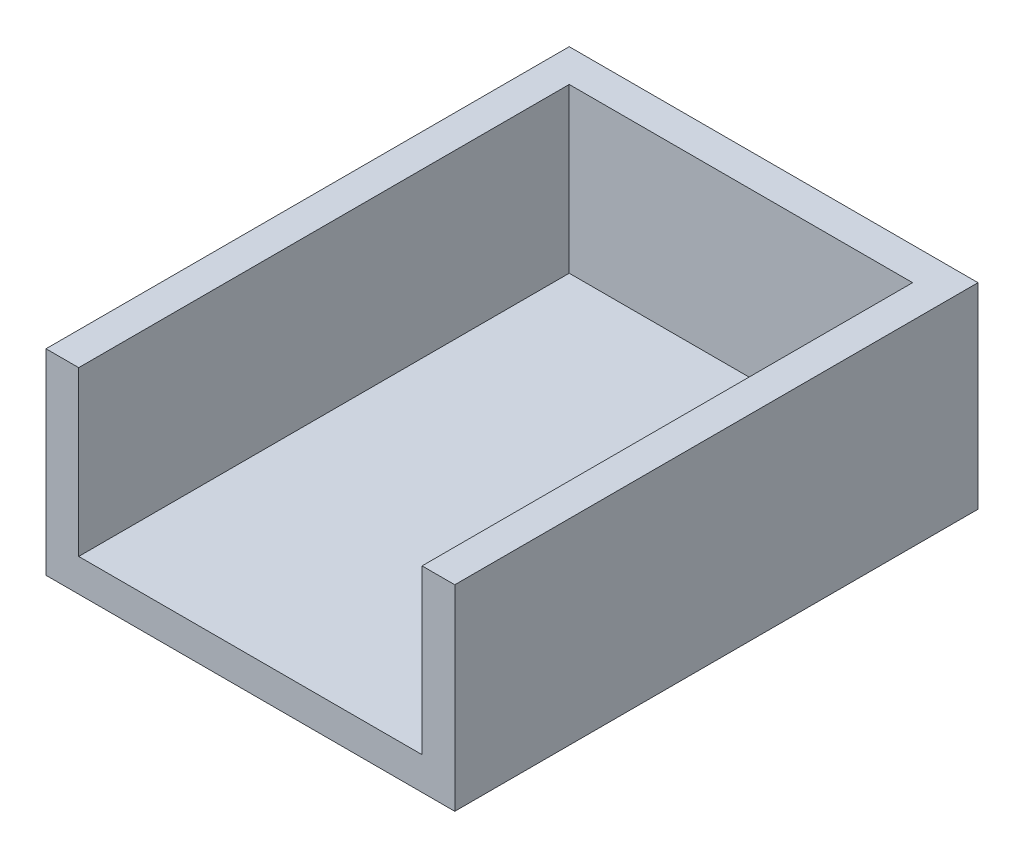
ISO-10303-21;
HEADER;
FILE_DESCRIPTION(('STEP AP214'),'2;1');
FILE_NAME('part.step','',(''),(''),'','','');
FILE_SCHEMA(('AUTOMOTIVE_DESIGN { 1 0 10303 214 1 1 1 1 }'));
ENDSEC;
DATA;
#1=APPLICATION_CONTEXT('core data for automotive mechanical design processes');
#2=APPLICATION_PROTOCOL_DEFINITION('international standard','automotive_design',2000,#1);
#3=PRODUCT_CONTEXT('',#1,'mechanical');
#4=PRODUCT('Part','Part','',(#3));
#5=PRODUCT_RELATED_PRODUCT_CATEGORY('part','',(#4));
#6=PRODUCT_DEFINITION_FORMATION('','',#4);
#7=PRODUCT_DEFINITION_CONTEXT('part definition',#1,'design');
#8=PRODUCT_DEFINITION('design','',#6,#7);
#9=PRODUCT_DEFINITION_SHAPE('','',#8);
#10=(LENGTH_UNIT() NAMED_UNIT(*) SI_UNIT(.MILLI.,.METRE.));
#11=(NAMED_UNIT(*) PLANE_ANGLE_UNIT() SI_UNIT($,.RADIAN.));
#12=(NAMED_UNIT(*) SI_UNIT($,.STERADIAN.) SOLID_ANGLE_UNIT());
#13=UNCERTAINTY_MEASURE_WITH_UNIT(LENGTH_MEASURE(1.E-05),#10,'distance_accuracy_value','');
#14=(GEOMETRIC_REPRESENTATION_CONTEXT(3) GLOBAL_UNCERTAINTY_ASSIGNED_CONTEXT((#13)) GLOBAL_UNIT_ASSIGNED_CONTEXT((#10,
#11,#12)) REPRESENTATION_CONTEXT('',''));
#15=CARTESIAN_POINT('',(0.,0.,0.));
#16=DIRECTION('',(0.,0.,1.));
#17=DIRECTION('',(1.,0.,0.));
#18=AXIS2_PLACEMENT_3D('',#15,#16,#17);
#19=CARTESIAN_POINT('',(0.,60.,0.));
#20=DIRECTION('',(0.,-1.,0.));
#21=DIRECTION('',(0.,0.,-1.));
#22=AXIS2_PLACEMENT_3D('',#19,#20,#21);
#23=PLANE('',#22);
#24=DIRECTION('',(0.,0.,-1.));
#25=VECTOR('',#24,1.);
#26=CARTESIAN_POINT('',(52.5,60.,0.));
#27=LINE('',#26,#25);
#28=CARTESIAN_POINT('',(52.5,60.,80.));
#29=VERTEX_POINT('',#28);
#30=CARTESIAN_POINT('',(52.5,60.,-70.));
#31=VERTEX_POINT('',#30);
#32=EDGE_CURVE('E201',#29,#31,#27,.T.);
#33=ORIENTED_EDGE('',*,*,#32,.F.);
#34=DIRECTION('',(1.,0.,0.));
#35=VECTOR('',#34,1.);
#36=CARTESIAN_POINT('',(-62.5,60.,80.));
#37=LINE('',#36,#35);
#38=CARTESIAN_POINT('',(62.5,60.,80.));
#39=VERTEX_POINT('',#38);
#40=EDGE_CURVE('E221',#29,#39,#37,.T.);
#41=ORIENTED_EDGE('',*,*,#40,.T.);
#42=DIRECTION('',(0.,0.,-1.));
#43=VECTOR('',#42,1.);
#44=CARTESIAN_POINT('',(62.5,60.,80.));
#45=LINE('',#44,#43);
#46=CARTESIAN_POINT('',(62.5,60.,-80.));
#47=VERTEX_POINT('',#46);
#48=EDGE_CURVE('E213',#39,#47,#45,.T.);
#49=ORIENTED_EDGE('',*,*,#48,.T.);
#50=DIRECTION('',(-1.,0.,0.));
#51=VECTOR('',#50,1.);
#52=CARTESIAN_POINT('',(-62.5,60.,-80.));
#53=LINE('',#52,#51);
#54=CARTESIAN_POINT('',(-62.5,60.,-80.));
#55=VERTEX_POINT('',#54);
#56=EDGE_CURVE('E216',#47,#55,#53,.T.);
#57=ORIENTED_EDGE('',*,*,#56,.T.);
#58=DIRECTION('',(0.,0.,1.));
#59=VECTOR('',#58,1.);
#60=CARTESIAN_POINT('',(-62.5,60.,80.));
#61=LINE('',#60,#59);
#62=CARTESIAN_POINT('',(-62.5,60.,80.));
#63=VERTEX_POINT('',#62);
#64=EDGE_CURVE('E219',#55,#63,#61,.T.);
#65=ORIENTED_EDGE('',*,*,#64,.T.);
#66=CARTESIAN_POINT('',(-52.5,60.,80.));
#67=VERTEX_POINT('',#66);
#68=EDGE_CURVE('E222',#63,#67,#37,.T.);
#69=ORIENTED_EDGE('',*,*,#68,.T.);
#70=DIRECTION('',(0.,0.,1.));
#71=VECTOR('',#70,1.);
#72=CARTESIAN_POINT('',(-52.5,60.,0.));
#73=LINE('',#72,#71);
#74=CARTESIAN_POINT('',(-52.5,60.,-70.));
#75=VERTEX_POINT('',#74);
#76=EDGE_CURVE('E205',#75,#67,#73,.T.);
#77=ORIENTED_EDGE('',*,*,#76,.F.);
#78=DIRECTION('',(-1.,0.,0.));
#79=VECTOR('',#78,1.);
#80=CARTESIAN_POINT('',(0.,60.,-70.));
#81=LINE('',#80,#79);
#82=EDGE_CURVE('E203',#31,#75,#81,.T.);
#83=ORIENTED_EDGE('',*,*,#82,.F.);
#84=EDGE_LOOP('',(#33,#41,#49,#57,#65,#69,#77,#83));
#85=FACE_BOUND('',#84,.T.);
#86=ADVANCED_FACE('F45',(#85),#23,.F.);
#87=CARTESIAN_POINT('',(62.5,60.,80.));
#88=DIRECTION('',(-1.,0.,0.));
#89=DIRECTION('',(0.,0.,1.));
#90=AXIS2_PLACEMENT_3D('',#87,#88,#89);
#91=PLANE('',#90);
#92=DIRECTION('',(0.,0.,-1.));
#93=VECTOR('',#92,1.);
#94=CARTESIAN_POINT('',(62.5,0.,80.));
#95=LINE('',#94,#93);
#96=CARTESIAN_POINT('',(62.5,0.,80.));
#97=VERTEX_POINT('',#96);
#98=CARTESIAN_POINT('',(62.5,0.,-80.));
#99=VERTEX_POINT('',#98);
#100=EDGE_CURVE('E194',#97,#99,#95,.T.);
#101=ORIENTED_EDGE('',*,*,#100,.T.);
#102=DIRECTION('',(0.,-1.,0.));
#103=VECTOR('',#102,1.);
#104=CARTESIAN_POINT('',(62.5,60.,-80.));
#105=LINE('',#104,#103);
#106=EDGE_CURVE('E243',#47,#99,#105,.T.);
#107=ORIENTED_EDGE('',*,*,#106,.F.);
#108=ORIENTED_EDGE('',*,*,#48,.F.);
#109=DIRECTION('',(0.,-1.,0.));
#110=VECTOR('',#109,1.);
#111=CARTESIAN_POINT('',(62.5,60.,80.));
#112=LINE('',#111,#110);
#113=EDGE_CURVE('E225',#39,#97,#112,.T.);
#114=ORIENTED_EDGE('',*,*,#113,.T.);
#115=EDGE_LOOP('',(#101,#107,#108,#114));
#116=FACE_BOUND('',#115,.T.);
#117=ADVANCED_FACE('F47',(#116),#91,.F.);
#118=CARTESIAN_POINT('',(-62.5,60.,-80.));
#119=DIRECTION('',(0.,0.,1.));
#120=DIRECTION('',(1.,0.,0.));
#121=AXIS2_PLACEMENT_3D('',#118,#119,#120);
#122=PLANE('',#121);
#123=DIRECTION('',(1.,0.,0.));
#124=VECTOR('',#123,1.);
#125=CARTESIAN_POINT('',(-58.1499143437494,28.000054699609,-80.));
#126=LINE('',#125,#124);
#127=CARTESIAN_POINT('',(-58.1499143437494,28.000054699609,-80.));
#128=VERTEX_POINT('',#127);
#129=CARTESIAN_POINT('',(53.2500986262211,28.0000546996091,-80.));
#130=VERTEX_POINT('',#129);
#131=EDGE_CURVE('E168',#128,#130,#126,.T.);
#132=ORIENTED_EDGE('',*,*,#131,.F.);
#133=CARTESIAN_POINT('',(-58.1499143437494,22.000077587793,-80.));
#134=DIRECTION('',(0.,0.,-1.));
#135=DIRECTION('',(-1.,0.,0.));
#136=AXIS2_PLACEMENT_3D('',#133,#134,#135);
#137=CIRCLE('',#136,5.999977111816);
#138=CARTESIAN_POINT('',(-62.5,26.1324473831524,-80.));
#139=VERTEX_POINT('',#138);
#140=EDGE_CURVE('E179',#139,#128,#137,.T.);
#141=ORIENTED_EDGE('',*,*,#140,.F.);
#142=DIRECTION('',(0.,-1.,0.));
#143=VECTOR('',#142,1.);
#144=CARTESIAN_POINT('',(-62.5,60.,-80.));
#145=LINE('',#144,#143);
#146=EDGE_CURVE('E240',#55,#139,#145,.T.);
#147=ORIENTED_EDGE('',*,*,#146,.F.);
#148=ORIENTED_EDGE('',*,*,#56,.F.);
#149=ORIENTED_EDGE('',*,*,#106,.T.);
#150=DIRECTION('',(-1.,0.,0.));
#151=VECTOR('',#150,1.);
#152=CARTESIAN_POINT('',(-62.5,0.,-80.));
#153=LINE('',#152,#151);
#154=CARTESIAN_POINT('',(-62.5,0.,-80.));
#155=VERTEX_POINT('',#154);
#156=EDGE_CURVE('E228',#99,#155,#153,.T.);
#157=ORIENTED_EDGE('',*,*,#156,.T.);
#158=CARTESIAN_POINT('',(-62.5,17.8677077924336,-80.));
#159=VERTEX_POINT('',#158);
#160=EDGE_CURVE('E239',#159,#155,#145,.T.);
#161=ORIENTED_EDGE('',*,*,#160,.F.);
#162=CARTESIAN_POINT('',(-58.1499143437494,16.000100475977,-80.));
#163=VERTEX_POINT('',#162);
#164=EDGE_CURVE('E171',#163,#159,#137,.T.);
#165=ORIENTED_EDGE('',*,*,#164,.F.);
#166=DIRECTION('',(-0.999999999999916,4.10918875098795E-07,0.));
#167=VECTOR('',#166,1.);
#168=CARTESIAN_POINT('',(53.2500986262211,16.000054699609,-80.));
#169=LINE('',#168,#167);
#170=CARTESIAN_POINT('',(53.2500986262211,16.000054699609,-80.));
#171=VERTEX_POINT('',#170);
#172=EDGE_CURVE('E177',#171,#163,#169,.T.);
#173=ORIENTED_EDGE('',*,*,#172,.F.);
#174=CARTESIAN_POINT('',(53.2500986262211,22.000054699609,-80.));
#175=DIRECTION('',(0.,0.,-1.));
#176=DIRECTION('',(-1.,0.,0.));
#177=AXIS2_PLACEMENT_3D('',#174,#175,#176);
#178=CIRCLE('',#177,6.00000000000002);
#179=EDGE_CURVE('E155',#130,#171,#178,.T.);
#180=ORIENTED_EDGE('',*,*,#179,.F.);
#181=EDGE_LOOP('',(#132,#141,#147,#148,#149,#157,#161,#165,#173,#180));
#182=FACE_BOUND('',#181,.T.);
#183=ADVANCED_FACE('F260',(#182),#122,.F.);
#184=CARTESIAN_POINT('',(-62.5,60.,80.));
#185=DIRECTION('',(1.,0.,0.));
#186=DIRECTION('',(0.,0.,-1.));
#187=AXIS2_PLACEMENT_3D('',#184,#185,#186);
#188=PLANE('',#187);
#189=DIRECTION('',(0.,1.,0.));
#190=VECTOR('',#189,1.);
#191=CARTESIAN_POINT('',(-62.5,60.,-73.));
#192=LINE('',#191,#190);
#193=CARTESIAN_POINT('',(-62.5,17.8677077924336,-73.));
#194=VERTEX_POINT('',#193);
#195=CARTESIAN_POINT('',(-62.5,26.1324473831524,-73.));
#196=VERTEX_POINT('',#195);
#197=EDGE_CURVE('E246',#194,#196,#192,.T.);
#198=ORIENTED_EDGE('',*,*,#197,.F.);
#199=DIRECTION('',(0.,0.,-1.));
#200=VECTOR('',#199,1.);
#201=CARTESIAN_POINT('',(-62.5,17.8677077924336,-73.));
#202=LINE('',#201,#200);
#203=EDGE_CURVE('E11',#194,#159,#202,.T.);
#204=ORIENTED_EDGE('',*,*,#203,.T.);
#205=ORIENTED_EDGE('',*,*,#160,.T.);
#206=DIRECTION('',(0.,0.,1.));
#207=VECTOR('',#206,1.);
#208=CARTESIAN_POINT('',(-62.5,0.,80.));
#209=LINE('',#208,#207);
#210=CARTESIAN_POINT('',(-62.5,0.,80.));
#211=VERTEX_POINT('',#210);
#212=EDGE_CURVE('E231',#155,#211,#209,.T.);
#213=ORIENTED_EDGE('',*,*,#212,.T.);
#214=DIRECTION('',(0.,-1.,0.));
#215=VECTOR('',#214,1.);
#216=CARTESIAN_POINT('',(-62.5,60.,80.));
#217=LINE('',#216,#215);
#218=EDGE_CURVE('E236',#63,#211,#217,.T.);
#219=ORIENTED_EDGE('',*,*,#218,.F.);
#220=ORIENTED_EDGE('',*,*,#64,.F.);
#221=ORIENTED_EDGE('',*,*,#146,.T.);
#222=DIRECTION('',(0.,0.,-1.));
#223=VECTOR('',#222,1.);
#224=CARTESIAN_POINT('',(-62.5,26.1324473831524,-73.));
#225=LINE('',#224,#223);
#226=EDGE_CURVE('E53',#139,#196,#225,.F.);
#227=ORIENTED_EDGE('',*,*,#226,.T.);
#228=EDGE_LOOP('',(#198,#204,#205,#213,#219,#220,#221,#227));
#229=FACE_BOUND('',#228,.T.);
#230=ADVANCED_FACE('F250',(#229),#188,.F.);
#231=CARTESIAN_POINT('',(-62.5,60.,80.));
#232=DIRECTION('',(0.,0.,-1.));
#233=DIRECTION('',(-1.,0.,0.));
#234=AXIS2_PLACEMENT_3D('',#231,#232,#233);
#235=PLANE('',#234);
#236=ORIENTED_EDGE('',*,*,#40,.F.);
#237=DIRECTION('',(0.,-1.,0.));
#238=VECTOR('',#237,1.);
#239=CARTESIAN_POINT('',(52.5,60.,80.));
#240=LINE('',#239,#238);
#241=CARTESIAN_POINT('',(52.5,10.,80.));
#242=VERTEX_POINT('',#241);
#243=EDGE_CURVE('E207',#29,#242,#240,.T.);
#244=ORIENTED_EDGE('',*,*,#243,.T.);
#245=DIRECTION('',(1.,0.,0.));
#246=VECTOR('',#245,1.);
#247=CARTESIAN_POINT('',(0.,10.,80.));
#248=LINE('',#247,#246);
#249=CARTESIAN_POINT('',(-52.5,10.,80.));
#250=VERTEX_POINT('',#249);
#251=EDGE_CURVE('E200',#250,#242,#248,.T.);
#252=ORIENTED_EDGE('',*,*,#251,.F.);
#253=DIRECTION('',(0.,-1.,0.));
#254=VECTOR('',#253,1.);
#255=CARTESIAN_POINT('',(-52.5,60.,80.));
#256=LINE('',#255,#254);
#257=EDGE_CURVE('E198',#67,#250,#256,.T.);
#258=ORIENTED_EDGE('',*,*,#257,.F.);
#259=ORIENTED_EDGE('',*,*,#68,.F.);
#260=ORIENTED_EDGE('',*,*,#218,.T.);
#261=DIRECTION('',(1.,0.,0.));
#262=VECTOR('',#261,1.);
#263=CARTESIAN_POINT('',(-62.5,0.,80.));
#264=LINE('',#263,#262);
#265=EDGE_CURVE('E217',#211,#97,#264,.T.);
#266=ORIENTED_EDGE('',*,*,#265,.T.);
#267=ORIENTED_EDGE('',*,*,#113,.F.);
#268=EDGE_LOOP('',(#236,#244,#252,#258,#259,#260,#266,#267));
#269=FACE_BOUND('',#268,.T.);
#270=ADVANCED_FACE('F290',(#269),#235,.F.);
#271=CARTESIAN_POINT('',(0.,0.,0.));
#272=DIRECTION('',(0.,-1.,0.));
#273=DIRECTION('',(0.,0.,-1.));
#274=AXIS2_PLACEMENT_3D('',#271,#272,#273);
#275=PLANE('',#274);
#276=ORIENTED_EDGE('',*,*,#100,.F.);
#277=ORIENTED_EDGE('',*,*,#265,.F.);
#278=ORIENTED_EDGE('',*,*,#212,.F.);
#279=ORIENTED_EDGE('',*,*,#156,.F.);
#280=EDGE_LOOP('',(#276,#277,#278,#279));
#281=FACE_BOUND('',#280,.T.);
#282=ADVANCED_FACE('F287',(#281),#275,.T.);
#283=CARTESIAN_POINT('',(52.5,60.,80.));
#284=DIRECTION('',(-1.,0.,0.));
#285=DIRECTION('',(0.,0.,1.));
#286=AXIS2_PLACEMENT_3D('',#283,#284,#285);
#287=PLANE('',#286);
#288=DIRECTION('',(0.,0.,-1.));
#289=VECTOR('',#288,1.);
#290=CARTESIAN_POINT('',(52.5,10.,0.));
#291=LINE('',#290,#289);
#292=CARTESIAN_POINT('',(52.5,10.,-70.));
#293=VERTEX_POINT('',#292);
#294=EDGE_CURVE('E183',#242,#293,#291,.T.);
#295=ORIENTED_EDGE('',*,*,#294,.F.);
#296=ORIENTED_EDGE('',*,*,#243,.F.);
#297=ORIENTED_EDGE('',*,*,#32,.T.);
#298=DIRECTION('',(0.,-1.,0.));
#299=VECTOR('',#298,1.);
#300=CARTESIAN_POINT('',(52.5,60.,-70.));
#301=LINE('',#300,#299);
#302=EDGE_CURVE('E191',#31,#293,#301,.T.);
#303=ORIENTED_EDGE('',*,*,#302,.T.);
#304=EDGE_LOOP('',(#295,#296,#297,#303));
#305=FACE_BOUND('',#304,.T.);
#306=ADVANCED_FACE('F289',(#305),#287,.T.);
#307=CARTESIAN_POINT('',(-62.5,60.,-70.));
#308=DIRECTION('',(0.,0.,1.));
#309=DIRECTION('',(1.,0.,0.));
#310=AXIS2_PLACEMENT_3D('',#307,#308,#309);
#311=PLANE('',#310);
#312=DIRECTION('',(-1.,0.,0.));
#313=VECTOR('',#312,1.);
#314=CARTESIAN_POINT('',(0.,10.,-70.));
#315=LINE('',#314,#313);
#316=CARTESIAN_POINT('',(-52.5,10.,-70.));
#317=VERTEX_POINT('',#316);
#318=EDGE_CURVE('E190',#293,#317,#315,.T.);
#319=ORIENTED_EDGE('',*,*,#318,.F.);
#320=ORIENTED_EDGE('',*,*,#302,.F.);
#321=ORIENTED_EDGE('',*,*,#82,.T.);
#322=DIRECTION('',(0.,-1.,0.));
#323=VECTOR('',#322,1.);
#324=CARTESIAN_POINT('',(-52.5,60.,-70.));
#325=LINE('',#324,#323);
#326=EDGE_CURVE('E68',#75,#317,#325,.T.);
#327=ORIENTED_EDGE('',*,*,#326,.T.);
#328=EDGE_LOOP('',(#319,#320,#321,#327));
#329=FACE_BOUND('',#328,.T.);
#330=ADVANCED_FACE('F361',(#329),#311,.T.);
#331=CARTESIAN_POINT('',(-52.5,60.,80.));
#332=DIRECTION('',(1.,0.,0.));
#333=DIRECTION('',(0.,0.,-1.));
#334=AXIS2_PLACEMENT_3D('',#331,#332,#333);
#335=PLANE('',#334);
#336=DIRECTION('',(0.,0.,1.));
#337=VECTOR('',#336,1.);
#338=CARTESIAN_POINT('',(-52.5,10.,0.));
#339=LINE('',#338,#337);
#340=EDGE_CURVE('E196',#317,#250,#339,.T.);
#341=ORIENTED_EDGE('',*,*,#340,.F.);
#342=ORIENTED_EDGE('',*,*,#326,.F.);
#343=ORIENTED_EDGE('',*,*,#76,.T.);
#344=ORIENTED_EDGE('',*,*,#257,.T.);
#345=EDGE_LOOP('',(#341,#342,#343,#344));
#346=FACE_BOUND('',#345,.T.);
#347=ADVANCED_FACE('F354',(#346),#335,.T.);
#348=CARTESIAN_POINT('',(0.,10.,0.));
#349=DIRECTION('',(0.,-1.,0.));
#350=DIRECTION('',(0.,0.,-1.));
#351=AXIS2_PLACEMENT_3D('',#348,#349,#350);
#352=PLANE('',#351);
#353=ORIENTED_EDGE('',*,*,#294,.T.);
#354=ORIENTED_EDGE('',*,*,#318,.T.);
#355=ORIENTED_EDGE('',*,*,#340,.T.);
#356=ORIENTED_EDGE('',*,*,#251,.T.);
#357=EDGE_LOOP('',(#353,#354,#355,#356));
#358=FACE_BOUND('',#357,.T.);
#359=ADVANCED_FACE('F285',(#358),#352,.F.);
#360=CARTESIAN_POINT('',(-58.1499143437494,22.000077587793,-73.));
#361=DIRECTION('',(0.,0.,-1.));
#362=DIRECTION('',(-1.,0.,0.));
#363=AXIS2_PLACEMENT_3D('',#360,#361,#362);
#364=CYLINDRICAL_SURFACE('',#363,5.999977111816);
#365=CARTESIAN_POINT('',(-58.1499143437494,22.000077587793,-73.));
#366=DIRECTION('',(0.,0.,-1.));
#367=DIRECTION('',(-1.,0.,0.));
#368=AXIS2_PLACEMENT_3D('',#365,#366,#367);
#369=CIRCLE('',#368,5.999977111816);
#370=CARTESIAN_POINT('',(-58.1499143437494,16.000100475977,-73.));
#371=VERTEX_POINT('',#370);
#372=EDGE_CURVE('E60',#371,#194,#369,.T.);
#373=ORIENTED_EDGE('',*,*,#372,.F.);
#374=DIRECTION('',(0.,0.,-1.));
#375=VECTOR('',#374,1.);
#376=CARTESIAN_POINT('',(-58.1499143437494,16.000100475977,-73.));
#377=LINE('',#376,#375);
#378=EDGE_CURVE('E159',#371,#163,#377,.T.);
#379=ORIENTED_EDGE('',*,*,#378,.T.);
#380=ORIENTED_EDGE('',*,*,#164,.T.);
#381=ORIENTED_EDGE('',*,*,#203,.F.);
#382=EDGE_LOOP('',(#373,#379,#380,#381));
#383=FACE_BOUND('',#382,.T.);
#384=ADVANCED_FACE('F313',(#383),#364,.F.);
#385=ORIENTED_EDGE('',*,*,#140,.T.);
#386=DIRECTION('',(0.,0.,-1.));
#387=VECTOR('',#386,1.);
#388=CARTESIAN_POINT('',(-58.1499143437494,28.000054699609,-73.));
#389=LINE('',#388,#387);
#390=CARTESIAN_POINT('',(-58.1499143437494,28.000054699609,-73.));
#391=VERTEX_POINT('',#390);
#392=EDGE_CURVE('E184',#391,#128,#389,.T.);
#393=ORIENTED_EDGE('',*,*,#392,.F.);
#394=EDGE_CURVE('E164',#196,#391,#369,.T.);
#395=ORIENTED_EDGE('',*,*,#394,.F.);
#396=ORIENTED_EDGE('',*,*,#226,.F.);
#397=EDGE_LOOP('',(#385,#393,#395,#396));
#398=FACE_BOUND('',#397,.T.);
#399=ADVANCED_FACE('F256',(#398),#364,.F.);
#400=CARTESIAN_POINT('',(53.2500986262211,22.000054699609,-73.));
#401=DIRECTION('',(0.,0.,-1.));
#402=DIRECTION('',(-1.,0.,0.));
#403=AXIS2_PLACEMENT_3D('',#400,#401,#402);
#404=PLANE('',#403);
#405=ORIENTED_EDGE('',*,*,#197,.T.);
#406=ORIENTED_EDGE('',*,*,#394,.T.);
#407=DIRECTION('',(1.,0.,0.));
#408=VECTOR('',#407,1.);
#409=CARTESIAN_POINT('',(-58.1499143437494,28.000054699609,-73.));
#410=LINE('',#409,#408);
#411=CARTESIAN_POINT('',(53.2500986262211,28.0000546996091,-73.));
#412=VERTEX_POINT('',#411);
#413=EDGE_CURVE('E160',#391,#412,#410,.T.);
#414=ORIENTED_EDGE('',*,*,#413,.T.);
#415=CARTESIAN_POINT('',(53.2500986262211,22.000054699609,-73.));
#416=DIRECTION('',(0.,0.,-1.));
#417=DIRECTION('',(-1.,0.,0.));
#418=AXIS2_PLACEMENT_3D('',#415,#416,#417);
#419=CIRCLE('',#418,6.00000000000002);
#420=CARTESIAN_POINT('',(53.2500986262211,16.000054699609,-73.));
#421=VERTEX_POINT('',#420);
#422=EDGE_CURVE('E152',#412,#421,#419,.T.);
#423=ORIENTED_EDGE('',*,*,#422,.T.);
#424=DIRECTION('',(-0.999999999999916,4.10918875098795E-07,0.));
#425=VECTOR('',#424,1.);
#426=CARTESIAN_POINT('',(53.2500986262211,16.000054699609,-73.));
#427=LINE('',#426,#425);
#428=EDGE_CURVE('E162',#421,#371,#427,.T.);
#429=ORIENTED_EDGE('',*,*,#428,.T.);
#430=ORIENTED_EDGE('',*,*,#372,.T.);
#431=EDGE_LOOP('',(#405,#406,#414,#423,#429,#430));
#432=FACE_BOUND('',#431,.T.);
#433=ADVANCED_FACE('F166',(#432),#404,.T.);
#434=CARTESIAN_POINT('',(53.2500986262211,22.000054699609,-73.));
#435=DIRECTION('',(0.,0.,-1.));
#436=DIRECTION('',(-1.,0.,0.));
#437=AXIS2_PLACEMENT_3D('',#434,#435,#436);
#438=CYLINDRICAL_SURFACE('',#437,6.00000000000002);
#439=ORIENTED_EDGE('',*,*,#179,.T.);
#440=DIRECTION('',(0.,0.,-1.));
#441=VECTOR('',#440,1.);
#442=CARTESIAN_POINT('',(53.2500986262211,16.000054699609,-73.));
#443=LINE('',#442,#441);
#444=EDGE_CURVE('E148',#421,#171,#443,.T.);
#445=ORIENTED_EDGE('',*,*,#444,.F.);
#446=ORIENTED_EDGE('',*,*,#422,.F.);
#447=DIRECTION('',(0.,0.,-1.));
#448=VECTOR('',#447,1.);
#449=CARTESIAN_POINT('',(53.2500986262211,28.0000546996091,-73.));
#450=LINE('',#449,#448);
#451=EDGE_CURVE('E181',#412,#130,#450,.T.);
#452=ORIENTED_EDGE('',*,*,#451,.T.);
#453=EDGE_LOOP('',(#439,#445,#446,#452));
#454=FACE_BOUND('',#453,.T.);
#455=ADVANCED_FACE('F150',(#454),#438,.F.);
#456=CARTESIAN_POINT('',(-58.1499143437494,28.000054699609,-73.));
#457=DIRECTION('',(0.,1.,0.));
#458=DIRECTION('',(-1.,0.,0.));
#459=AXIS2_PLACEMENT_3D('',#456,#457,#458);
#460=PLANE('',#459);
#461=ORIENTED_EDGE('',*,*,#131,.T.);
#462=ORIENTED_EDGE('',*,*,#451,.F.);
#463=ORIENTED_EDGE('',*,*,#413,.F.);
#464=ORIENTED_EDGE('',*,*,#392,.T.);
#465=EDGE_LOOP('',(#461,#462,#463,#464));
#466=FACE_BOUND('',#465,.T.);
#467=ADVANCED_FACE('F262',(#466),#460,.F.);
#468=CARTESIAN_POINT('',(53.2500986262211,16.000054699609,-73.));
#469=DIRECTION('',(-4.10918875098795E-07,-0.999999999999916,0.));
#470=DIRECTION('',(0.999999999999916,-4.10918875098795E-07,0.));
#471=AXIS2_PLACEMENT_3D('',#468,#469,#470);
#472=PLANE('',#471);
#473=ORIENTED_EDGE('',*,*,#172,.T.);
#474=ORIENTED_EDGE('',*,*,#378,.F.);
#475=ORIENTED_EDGE('',*,*,#428,.F.);
#476=ORIENTED_EDGE('',*,*,#444,.T.);
#477=EDGE_LOOP('',(#473,#474,#475,#476));
#478=FACE_BOUND('',#477,.T.);
#479=ADVANCED_FACE('F163',(#478),#472,.F.);
#480=CLOSED_SHELL('',(#86,#117,#183,#230,#270,#282,#306,#330,#347,#359,#384,#399,#433,#455,#467,#479));
#481=MANIFOLD_SOLID_BREP('B2',#480);
#482=ADVANCED_BREP_SHAPE_REPRESENTATION('',(#18,#481),#14);
#483=SHAPE_DEFINITION_REPRESENTATION(#9,#482);
ENDSEC;
END-ISO-10303-21;
